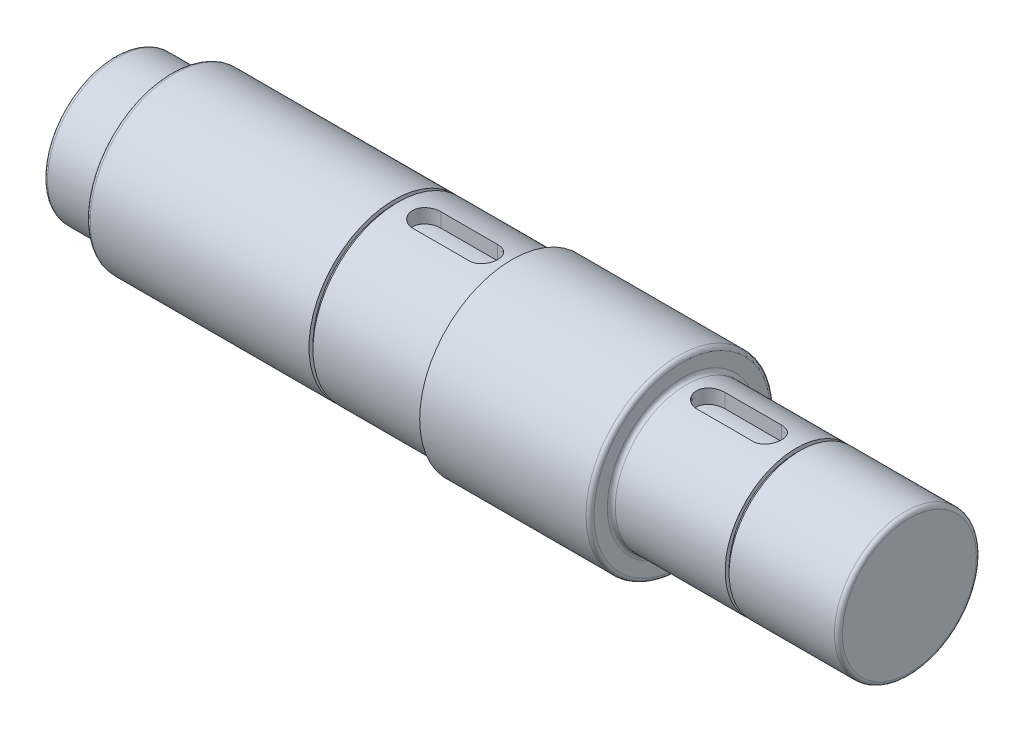
ISO-10303-21;
HEADER;
FILE_DESCRIPTION(('STEP AP214'),'2;1');
FILE_NAME('part.step','',(''),(''),'','','');
FILE_SCHEMA(('AUTOMOTIVE_DESIGN { 1 0 10303 214 1 1 1 1 }'));
ENDSEC;
DATA;
#1=APPLICATION_CONTEXT('core data for automotive mechanical design processes');
#2=APPLICATION_PROTOCOL_DEFINITION('international standard','automotive_design',2000,#1);
#3=PRODUCT_CONTEXT('',#1,'mechanical');
#4=PRODUCT('Part','Part','',(#3));
#5=PRODUCT_RELATED_PRODUCT_CATEGORY('part','',(#4));
#6=PRODUCT_DEFINITION_FORMATION('','',#4);
#7=PRODUCT_DEFINITION_CONTEXT('part definition',#1,'design');
#8=PRODUCT_DEFINITION('design','',#6,#7);
#9=PRODUCT_DEFINITION_SHAPE('','',#8);
#10=(LENGTH_UNIT() NAMED_UNIT(*) SI_UNIT(.MILLI.,.METRE.));
#11=(NAMED_UNIT(*) PLANE_ANGLE_UNIT() SI_UNIT($,.RADIAN.));
#12=(NAMED_UNIT(*) SI_UNIT($,.STERADIAN.) SOLID_ANGLE_UNIT());
#13=UNCERTAINTY_MEASURE_WITH_UNIT(LENGTH_MEASURE(1.E-05),#10,'distance_accuracy_value','');
#14=(GEOMETRIC_REPRESENTATION_CONTEXT(3) GLOBAL_UNCERTAINTY_ASSIGNED_CONTEXT((#13)) GLOBAL_UNIT_ASSIGNED_CONTEXT((#10,
#11,#12)) REPRESENTATION_CONTEXT('',''));
#15=CARTESIAN_POINT('',(0.,0.,0.));
#16=DIRECTION('',(0.,0.,1.));
#17=DIRECTION('',(1.,0.,0.));
#18=AXIS2_PLACEMENT_3D('',#15,#16,#17);
#19=CARTESIAN_POINT('',(330.2,0.,0.));
#20=DIRECTION('',(1.,0.,0.));
#21=DIRECTION('',(0.,0.,-1.));
#22=AXIS2_PLACEMENT_3D('',#19,#20,#21);
#23=CYLINDRICAL_SURFACE('',#22,31.75);
#24=CARTESIAN_POINT('',(255.778,0.,0.));
#25=DIRECTION('',(1.,0.,0.));
#26=DIRECTION('',(0.,0.,-1.));
#27=AXIS2_PLACEMENT_3D('',#24,#25,#26);
#28=CIRCLE('',#27,31.75);
#29=CARTESIAN_POINT('',(255.778,0.,-31.75));
#30=VERTEX_POINT('',#29);
#31=EDGE_CURVE('E261',#30,#30,#28,.T.);
#32=ORIENTED_EDGE('',*,*,#31,.T.);
#33=EDGE_LOOP('',(#32));
#34=FACE_BOUND('',#33,.T.);
#35=CARTESIAN_POINT('',(304.927,0.,0.));
#36=DIRECTION('',(1.,0.,0.));
#37=DIRECTION('',(0.,0.,-1.));
#38=AXIS2_PLACEMENT_3D('',#35,#36,#37);
#39=CIRCLE('',#38,31.75);
#40=CARTESIAN_POINT('',(304.927,0.,-31.75));
#41=VERTEX_POINT('',#40);
#42=EDGE_CURVE('E270',#41,#41,#39,.T.);
#43=ORIENTED_EDGE('',*,*,#42,.F.);
#44=EDGE_LOOP('',(#43));
#45=FACE_BOUND('',#44,.T.);
#46=CARTESIAN_POINT('',(292.1,31.1085197333463,6.35000000000002));
#47=CARTESIAN_POINT('',(292.941183858489,31.1085197333463,6.35000000000002));
#48=CARTESIAN_POINT('',(293.766428579741,31.143702637818,6.18365868766048));
#49=CARTESIAN_POINT('',(295.303132376778,31.2636096253235,5.54567957546157));
#50=CARTESIAN_POINT('',(296.006121908443,31.3474662779308,5.07414415278685));
#51=CARTESIAN_POINT('',(297.758254996811,31.597773091446,3.32198124296135));
#52=CARTESIAN_POINT('',(298.448650022899,31.749730004665,1.66607568080148));
#53=CARTESIAN_POINT('',(298.451345795129,31.7502691589406,-1.65576927079387));
#54=CARTESIAN_POINT('',(297.77212094636,31.599838788718,-3.30690169859766));
#55=CARTESIAN_POINT('',(295.412821853986,31.2626237555181,-5.66866529599972));
#56=CARTESIAN_POINT('',(293.782378674894,31.1085197333463,-6.35000000000002));
#57=CARTESIAN_POINT('',(292.1,31.1085197333463,-6.35000000000002));
#58=B_SPLINE_CURVE_WITH_KNOTS('',3,(#46,#47,#48,#49,#50,#51,#52,#53,#54,#55,#56,#57),
.UNSPECIFIED.,.F.,.F.,(4,2,2,2,2,4),(0.,0.125,0.25,0.5,0.75,1.),.UNSPECIFIED.);
#59=CARTESIAN_POINT('',(292.1,31.1085197333463,6.35000000000002));
#60=VERTEX_POINT('',#59);
#61=CARTESIAN_POINT('',(292.1,31.1085197333463,-6.35000000000002));
#62=VERTEX_POINT('',#61);
#63=EDGE_CURVE('E64',#60,#62,#58,.T.);
#64=ORIENTED_EDGE('',*,*,#63,.F.);
#65=DIRECTION('',(1.,0.,0.));
#66=VECTOR('',#65,1.);
#67=CARTESIAN_POINT('',(330.2,31.1085197333463,6.35000000000002));
#68=LINE('',#67,#66);
#69=CARTESIAN_POINT('',(266.7,31.1085197333463,6.35000000000002));
#70=VERTEX_POINT('',#69);
#71=EDGE_CURVE('E142',#70,#60,#68,.T.);
#72=ORIENTED_EDGE('',*,*,#71,.F.);
#73=CARTESIAN_POINT('',(266.7,31.1085197333463,-6.35000000000002));
#74=CARTESIAN_POINT('',(265.858816141511,31.1085197333463,-6.35000000000002));
#75=CARTESIAN_POINT('',(265.033571420259,31.143702637818,-6.18365868766048));
#76=CARTESIAN_POINT('',(263.496867623222,31.2636096253235,-5.54567957546157));
#77=CARTESIAN_POINT('',(262.793878091557,31.3474662779308,-5.07414415278685));
#78=CARTESIAN_POINT('',(261.041745003189,31.597773091446,-3.32198124296135));
#79=CARTESIAN_POINT('',(260.351349977102,31.749730004665,-1.66607568080148));
#80=CARTESIAN_POINT('',(260.348654204871,31.7502691589406,1.65576927079387));
#81=CARTESIAN_POINT('',(261.02787905364,31.599838788718,3.30690169859766));
#82=CARTESIAN_POINT('',(263.387178146013,31.2626237555181,5.66866529599972));
#83=CARTESIAN_POINT('',(265.017621325106,31.1085197333463,6.35000000000002));
#84=CARTESIAN_POINT('',(266.7,31.1085197333463,6.35000000000002));
#85=B_SPLINE_CURVE_WITH_KNOTS('',3,(#73,#74,#75,#76,#77,#78,#79,#80,#81,#82,#83,#84),
.UNSPECIFIED.,.F.,.F.,(4,2,2,2,2,4),(0.,0.125,0.25,0.5,0.75,1.),.UNSPECIFIED.);
#86=CARTESIAN_POINT('',(266.7,31.1085197333463,-6.35000000000002));
#87=VERTEX_POINT('',#86);
#88=EDGE_CURVE('E124',#87,#70,#85,.T.);
#89=ORIENTED_EDGE('',*,*,#88,.F.);
#90=DIRECTION('',(1.,0.,0.));
#91=VECTOR('',#90,1.);
#92=CARTESIAN_POINT('',(330.2,31.1085197333463,-6.35000000000002));
#93=LINE('',#92,#91);
#94=EDGE_CURVE('E133',#87,#62,#93,.T.);
#95=ORIENTED_EDGE('',*,*,#94,.T.);
#96=EDGE_LOOP('',(#64,#72,#89,#95));
#97=FACE_BOUND('',#96,.T.);
#98=ADVANCED_FACE('F45',(#34,#45,#97),#23,.T.);
#99=CARTESIAN_POINT('',(330.2,0.,0.));
#100=DIRECTION('',(1.,0.,0.));
#101=DIRECTION('',(0.,0.,-1.));
#102=AXIS2_PLACEMENT_3D('',#99,#100,#101);
#103=CYLINDRICAL_SURFACE('',#102,38.1);
#104=CARTESIAN_POINT('',(126.873,0.,0.));
#105=DIRECTION('',(1.,0.,0.));
#106=DIRECTION('',(0.,0.,-1.));
#107=AXIS2_PLACEMENT_3D('',#104,#105,#106);
#108=CIRCLE('',#107,38.1);
#109=CARTESIAN_POINT('',(126.873,0.,-38.1));
#110=VERTEX_POINT('',#109);
#111=EDGE_CURVE('E292',#110,#110,#108,.T.);
#112=ORIENTED_EDGE('',*,*,#111,.T.);
#113=EDGE_LOOP('',(#112));
#114=FACE_BOUND('',#113,.T.);
#115=CARTESIAN_POINT('',(177.8,0.,0.));
#116=DIRECTION('',(1.,0.,0.));
#117=DIRECTION('',(0.,0.,-1.));
#118=AXIS2_PLACEMENT_3D('',#115,#116,#117);
#119=CIRCLE('',#118,38.1);
#120=CARTESIAN_POINT('',(177.8,0.,-38.1));
#121=VERTEX_POINT('',#120);
#122=EDGE_CURVE('E289',#121,#121,#119,.T.);
#123=ORIENTED_EDGE('',*,*,#122,.F.);
#124=EDGE_LOOP('',(#123));
#125=FACE_BOUND('',#124,.T.);
#126=CARTESIAN_POINT('',(165.1,37.5671066226825,6.35000000000001));
#127=CARTESIAN_POINT('',(165.9404912156,37.5671066226825,6.35000000000001));
#128=CARTESIAN_POINT('',(166.765119907732,37.5961692347142,6.1840295214046));
#129=CARTESIAN_POINT('',(168.30219711681,37.6955353217467,5.54624008259869));
#130=CARTESIAN_POINT('',(169.005630987988,37.7651234129585,5.07464368548446));
#131=CARTESIAN_POINT('',(170.759335967874,37.9732531596112,3.32088304499708));
#132=CARTESIAN_POINT('',(171.448721103243,38.0997868506017,1.66436480079445));
#133=CARTESIAN_POINT('',(171.451275136449,38.1002125226802,-1.65459178591281));
#134=CARTESIAN_POINT('',(170.774511526088,37.9751325419471,-3.30436660193666));
#135=CARTESIAN_POINT('',(168.410969922329,37.6944708458059,-5.67066114956058));
#136=CARTESIAN_POINT('',(166.780983540741,37.5671066226825,-6.34999999999999));
#137=CARTESIAN_POINT('',(165.1,37.5671066226825,-6.34999999999999));
#138=B_SPLINE_CURVE_WITH_KNOTS('',3,(#126,#127,#128,#129,#130,#131,#132,#133,#134,#135,#136,
#137),.UNSPECIFIED.,.F.,.F.,(4,2,2,2,2,4),(0.,0.125,0.25,0.5,0.75,1.),.UNSPECIFIED.);
#139=CARTESIAN_POINT('',(165.1,37.5671066226825,6.34999999999998));
#140=VERTEX_POINT('',#139);
#141=CARTESIAN_POINT('',(165.1,37.5671066226825,-6.35000000000006));
#142=VERTEX_POINT('',#141);
#143=EDGE_CURVE('E73',#140,#142,#138,.T.);
#144=ORIENTED_EDGE('',*,*,#143,.F.);
#145=DIRECTION('',(1.,0.,0.));
#146=VECTOR('',#145,1.);
#147=CARTESIAN_POINT('',(330.2,37.5671066226825,6.34999999999995));
#148=LINE('',#147,#146);
#149=CARTESIAN_POINT('',(139.7,37.5671066226825,6.35));
#150=VERTEX_POINT('',#149);
#151=EDGE_CURVE('E386',#150,#140,#148,.T.);
#152=ORIENTED_EDGE('',*,*,#151,.F.);
#153=CARTESIAN_POINT('',(139.7,37.5671066226825,-6.34999999999998));
#154=CARTESIAN_POINT('',(138.8595087844,37.5671066226825,-6.34999999999998));
#155=CARTESIAN_POINT('',(138.034880092268,37.5961692347142,-6.18402952140457));
#156=CARTESIAN_POINT('',(136.49780288319,37.6955353217467,-5.54624008259866));
#157=CARTESIAN_POINT('',(135.794369012012,37.7651234129585,-5.07464368548443));
#158=CARTESIAN_POINT('',(134.040664032126,37.9732531596112,-3.32088304499704));
#159=CARTESIAN_POINT('',(133.351278896757,38.0997868506017,-1.66436480079441));
#160=CARTESIAN_POINT('',(133.348724863551,38.1002125226802,1.65459178591284));
#161=CARTESIAN_POINT('',(134.025488473912,37.9751325419471,3.3043666019367));
#162=CARTESIAN_POINT('',(136.389030077671,37.6944708458059,5.67066114956061));
#163=CARTESIAN_POINT('',(138.019016459259,37.5671066226825,6.35000000000002));
#164=CARTESIAN_POINT('',(139.7,37.5671066226825,6.35000000000002));
#165=B_SPLINE_CURVE_WITH_KNOTS('',3,(#153,#154,#155,#156,#157,#158,#159,#160,#161,#162,#163,
#164),.UNSPECIFIED.,.F.,.F.,(4,2,2,2,2,4),(0.,0.125,0.25,0.5,0.75,1.),.UNSPECIFIED.);
#166=CARTESIAN_POINT('',(139.7,37.5671066226825,-6.35000000000002));
#167=VERTEX_POINT('',#166);
#168=EDGE_CURVE('E204',#167,#150,#165,.T.);
#169=ORIENTED_EDGE('',*,*,#168,.F.);
#170=DIRECTION('',(1.,0.,0.));
#171=VECTOR('',#170,1.);
#172=CARTESIAN_POINT('',(330.2,37.5671066226825,-6.35000000000006));
#173=LINE('',#172,#171);
#174=EDGE_CURVE('E322',#167,#142,#173,.T.);
#175=ORIENTED_EDGE('',*,*,#174,.T.);
#176=EDGE_LOOP('',(#144,#152,#169,#175));
#177=FACE_BOUND('',#176,.T.);
#178=ADVANCED_FACE('F160',(#114,#125,#177),#103,.T.);
#179=CARTESIAN_POINT('',(355.6,0.,0.));
#180=DIRECTION('',(1.,0.,0.));
#181=DIRECTION('',(0.,0.,-1.));
#182=AXIS2_PLACEMENT_3D('',#179,#180,#181);
#183=PLANE('',#182);
#184=CARTESIAN_POINT('',(355.6,0.,0.));
#185=DIRECTION('',(1.,0.,0.));
#186=DIRECTION('',(0.,0.,-1.));
#187=AXIS2_PLACEMENT_3D('',#184,#185,#186);
#188=CIRCLE('',#187,29.972);
#189=CARTESIAN_POINT('',(355.6,0.,-29.972));
#190=VERTEX_POINT('',#189);
#191=EDGE_CURVE('E11',#190,#190,#188,.T.);
#192=ORIENTED_EDGE('',*,*,#191,.T.);
#193=EDGE_LOOP('',(#192));
#194=FACE_BOUND('',#193,.T.);
#195=ADVANCED_FACE('F47',(#194),#183,.T.);
#196=CARTESIAN_POINT('',(353.822,0.,0.));
#197=DIRECTION('',(1.,0.,0.));
#198=DIRECTION('',(0.,0.,-1.));
#199=AXIS2_PLACEMENT_3D('',#196,#197,#198);
#200=TOROIDAL_SURFACE('',#199,29.972,1.778);
#201=CARTESIAN_POINT('',(353.822,0.,0.));
#202=DIRECTION('',(1.,0.,0.));
#203=DIRECTION('',(0.,0.,-1.));
#204=AXIS2_PLACEMENT_3D('',#201,#202,#203);
#205=CIRCLE('',#204,31.75);
#206=CARTESIAN_POINT('',(353.822,0.,-31.75));
#207=VERTEX_POINT('',#206);
#208=EDGE_CURVE('E56',#207,#207,#205,.T.);
#209=ORIENTED_EDGE('',*,*,#208,.T.);
#210=EDGE_LOOP('',(#209));
#211=FACE_BOUND('',#210,.T.);
#212=ORIENTED_EDGE('',*,*,#191,.F.);
#213=EDGE_LOOP('',(#212));
#214=FACE_BOUND('',#213,.T.);
#215=ADVANCED_FACE('F179',(#211,#214),#200,.T.);
#216=CARTESIAN_POINT('',(330.2,0.,0.));
#217=DIRECTION('',(1.,0.,0.));
#218=DIRECTION('',(0.,0.,-1.));
#219=AXIS2_PLACEMENT_3D('',#216,#217,#218);
#220=CYLINDRICAL_SURFACE('',#219,31.75);
#221=ORIENTED_EDGE('',*,*,#208,.F.);
#222=EDGE_LOOP('',(#221));
#223=FACE_BOUND('',#222,.T.);
#224=CARTESIAN_POINT('',(306.705,0.,0.));
#225=DIRECTION('',(1.,0.,0.));
#226=DIRECTION('',(0.,0.,-1.));
#227=AXIS2_PLACEMENT_3D('',#224,#225,#226);
#228=CIRCLE('',#227,31.75);
#229=CARTESIAN_POINT('',(306.705,0.,-31.75));
#230=VERTEX_POINT('',#229);
#231=EDGE_CURVE('E191',#230,#230,#228,.T.);
#232=ORIENTED_EDGE('',*,*,#231,.T.);
#233=EDGE_LOOP('',(#232));
#234=FACE_BOUND('',#233,.T.);
#235=ADVANCED_FACE('F176',(#223,#234),#220,.T.);
#236=CARTESIAN_POINT('',(306.705,0.,-9.575673587392E-12));
#237=DIRECTION('',(-1.,0.,0.));
#238=DIRECTION('',(0.,0.,1.));
#239=AXIS2_PLACEMENT_3D('',#236,#237,#238);
#240=PLANE('',#239);
#241=CARTESIAN_POINT('',(306.705,0.,0.));
#242=DIRECTION('',(1.,0.,0.));
#243=DIRECTION('',(0.,0.,-1.));
#244=AXIS2_PLACEMENT_3D('',#241,#242,#243);
#245=CIRCLE('',#244,29.972);
#246=CARTESIAN_POINT('',(306.705,0.,-29.972));
#247=VERTEX_POINT('',#246);
#248=EDGE_CURVE('E194',#247,#247,#245,.T.);
#249=ORIENTED_EDGE('',*,*,#248,.T.);
#250=EDGE_LOOP('',(#249));
#251=FACE_BOUND('',#250,.T.);
#252=ORIENTED_EDGE('',*,*,#231,.F.);
#253=EDGE_LOOP('',(#252));
#254=FACE_BOUND('',#253,.T.);
#255=ADVANCED_FACE('F172',(#251,#254),#240,.T.);
#256=CARTESIAN_POINT('',(330.2,0.,0.));
#257=DIRECTION('',(1.,0.,0.));
#258=DIRECTION('',(0.,0.,-1.));
#259=AXIS2_PLACEMENT_3D('',#256,#257,#258);
#260=CYLINDRICAL_SURFACE('',#259,29.972);
#261=ORIENTED_EDGE('',*,*,#248,.F.);
#262=EDGE_LOOP('',(#261));
#263=FACE_BOUND('',#262,.T.);
#264=CARTESIAN_POINT('',(304.927,0.,0.));
#265=DIRECTION('',(1.,0.,0.));
#266=DIRECTION('',(0.,0.,-1.));
#267=AXIS2_PLACEMENT_3D('',#264,#265,#266);
#268=CIRCLE('',#267,29.972);
#269=CARTESIAN_POINT('',(304.927,0.,-29.972));
#270=VERTEX_POINT('',#269);
#271=EDGE_CURVE('E273',#270,#270,#268,.T.);
#272=ORIENTED_EDGE('',*,*,#271,.T.);
#273=EDGE_LOOP('',(#272));
#274=FACE_BOUND('',#273,.T.);
#275=ADVANCED_FACE('F168',(#263,#274),#260,.T.);
#276=CARTESIAN_POINT('',(304.927,0.,-9.5201624361607E-12));
#277=DIRECTION('',(-1.,0.,0.));
#278=DIRECTION('',(0.,0.,1.));
#279=AXIS2_PLACEMENT_3D('',#276,#277,#278);
#280=PLANE('',#279);
#281=ORIENTED_EDGE('',*,*,#271,.F.);
#282=EDGE_LOOP('',(#281));
#283=FACE_BOUND('',#282,.T.);
#284=ORIENTED_EDGE('',*,*,#42,.T.);
#285=EDGE_LOOP('',(#284));
#286=FACE_BOUND('',#285,.T.);
#287=ADVANCED_FACE('F164',(#283,#286),#280,.F.);
#288=CARTESIAN_POINT('',(255.778,0.,0.));
#289=DIRECTION('',(1.,0.,0.));
#290=DIRECTION('',(0.,0.,-1.));
#291=AXIS2_PLACEMENT_3D('',#288,#289,#290);
#292=TOROIDAL_SURFACE('',#291,33.528,1.778);
#293=CARTESIAN_POINT('',(254.,0.,0.));
#294=DIRECTION('',(1.,0.,0.));
#295=DIRECTION('',(0.,0.,-1.));
#296=AXIS2_PLACEMENT_3D('',#293,#294,#295);
#297=CIRCLE('',#296,33.528);
#298=CARTESIAN_POINT('',(254.,0.,-33.528));
#299=VERTEX_POINT('',#298);
#300=EDGE_CURVE('E254',#299,#299,#297,.T.);
#301=ORIENTED_EDGE('',*,*,#300,.T.);
#302=EDGE_LOOP('',(#301));
#303=FACE_BOUND('',#302,.T.);
#304=ORIENTED_EDGE('',*,*,#31,.F.);
#305=EDGE_LOOP('',(#304));
#306=FACE_BOUND('',#305,.T.);
#307=ADVANCED_FACE('F162',(#303,#306),#292,.F.);
#308=CARTESIAN_POINT('',(254.,0.,0.));
#309=DIRECTION('',(-1.,0.,0.));
#310=DIRECTION('',(0.,0.,1.));
#311=AXIS2_PLACEMENT_3D('',#308,#309,#310);
#312=PLANE('',#311);
#313=ORIENTED_EDGE('',*,*,#300,.F.);
#314=EDGE_LOOP('',(#313));
#315=FACE_BOUND('',#314,.T.);
#316=CARTESIAN_POINT('',(254.,0.,0.));
#317=DIRECTION('',(1.,0.,0.));
#318=DIRECTION('',(0.,0.,-1.));
#319=AXIS2_PLACEMENT_3D('',#316,#317,#318);
#320=CIRCLE('',#319,39.497);
#321=CARTESIAN_POINT('',(254.,0.,-39.497));
#322=VERTEX_POINT('',#321);
#323=EDGE_CURVE('E257',#322,#322,#320,.T.);
#324=ORIENTED_EDGE('',*,*,#323,.T.);
#325=EDGE_LOOP('',(#324));
#326=FACE_BOUND('',#325,.T.);
#327=ADVANCED_FACE('F243',(#315,#326),#312,.F.);
#328=CARTESIAN_POINT('',(252.222,0.,0.));
#329=DIRECTION('',(1.,0.,0.));
#330=DIRECTION('',(0.,0.,-1.));
#331=AXIS2_PLACEMENT_3D('',#328,#329,#330);
#332=TOROIDAL_SURFACE('',#331,39.497,1.778);
#333=CARTESIAN_POINT('',(252.222,0.,0.));
#334=DIRECTION('',(1.,0.,0.));
#335=DIRECTION('',(0.,0.,-1.));
#336=AXIS2_PLACEMENT_3D('',#333,#334,#335);
#337=CIRCLE('',#336,41.275);
#338=CARTESIAN_POINT('',(252.222,0.,-41.275));
#339=VERTEX_POINT('',#338);
#340=EDGE_CURVE('E259',#339,#339,#337,.T.);
#341=ORIENTED_EDGE('',*,*,#340,.T.);
#342=EDGE_LOOP('',(#341));
#343=FACE_BOUND('',#342,.T.);
#344=ORIENTED_EDGE('',*,*,#323,.F.);
#345=EDGE_LOOP('',(#344));
#346=FACE_BOUND('',#345,.T.);
#347=ADVANCED_FACE('F240',(#343,#346),#332,.T.);
#348=CARTESIAN_POINT('',(330.2,0.,0.));
#349=DIRECTION('',(1.,0.,0.));
#350=DIRECTION('',(0.,0.,-1.));
#351=AXIS2_PLACEMENT_3D('',#348,#349,#350);
#352=CYLINDRICAL_SURFACE('',#351,41.275);
#353=ORIENTED_EDGE('',*,*,#340,.F.);
#354=EDGE_LOOP('',(#353));
#355=FACE_BOUND('',#354,.T.);
#356=CARTESIAN_POINT('',(177.8,0.,0.));
#357=DIRECTION('',(1.,0.,0.));
#358=DIRECTION('',(0.,0.,-1.));
#359=AXIS2_PLACEMENT_3D('',#356,#357,#358);
#360=CIRCLE('',#359,41.275);
#361=CARTESIAN_POINT('',(177.8,0.,-41.275));
#362=VERTEX_POINT('',#361);
#363=EDGE_CURVE('E264',#362,#362,#360,.T.);
#364=ORIENTED_EDGE('',*,*,#363,.T.);
#365=EDGE_LOOP('',(#364));
#366=FACE_BOUND('',#365,.T.);
#367=ADVANCED_FACE('F236',(#355,#366),#352,.T.);
#368=CARTESIAN_POINT('',(177.8,0.,0.));
#369=DIRECTION('',(1.,0.,0.));
#370=DIRECTION('',(0.,0.,-1.));
#371=AXIS2_PLACEMENT_3D('',#368,#369,#370);
#372=PLANE('',#371);
#373=ORIENTED_EDGE('',*,*,#363,.F.);
#374=EDGE_LOOP('',(#373));
#375=FACE_BOUND('',#374,.T.);
#376=ORIENTED_EDGE('',*,*,#122,.T.);
#377=EDGE_LOOP('',(#376));
#378=FACE_BOUND('',#377,.T.);
#379=ADVANCED_FACE('F232',(#375,#378),#372,.F.);
#380=CARTESIAN_POINT('',(126.873,0.,0.));
#381=DIRECTION('',(-1.,0.,0.));
#382=DIRECTION('',(0.,0.,1.));
#383=AXIS2_PLACEMENT_3D('',#380,#381,#382);
#384=PLANE('',#383);
#385=CARTESIAN_POINT('',(126.873,0.,0.));
#386=DIRECTION('',(1.,0.,0.));
#387=DIRECTION('',(0.,0.,-1.));
#388=AXIS2_PLACEMENT_3D('',#385,#386,#387);
#389=CIRCLE('',#388,36.322);
#390=CARTESIAN_POINT('',(126.873,0.,-36.322));
#391=VERTEX_POINT('',#390);
#392=EDGE_CURVE('E295',#391,#391,#389,.T.);
#393=ORIENTED_EDGE('',*,*,#392,.T.);
#394=EDGE_LOOP('',(#393));
#395=FACE_BOUND('',#394,.T.);
#396=ORIENTED_EDGE('',*,*,#111,.F.);
#397=EDGE_LOOP('',(#396));
#398=FACE_BOUND('',#397,.T.);
#399=ADVANCED_FACE('F228',(#395,#398),#384,.T.);
#400=CARTESIAN_POINT('',(330.2,0.,0.));
#401=DIRECTION('',(1.,0.,0.));
#402=DIRECTION('',(0.,0.,-1.));
#403=AXIS2_PLACEMENT_3D('',#400,#401,#402);
#404=CYLINDRICAL_SURFACE('',#403,36.322);
#405=CARTESIAN_POINT('',(125.095,0.,0.));
#406=DIRECTION('',(1.,0.,0.));
#407=DIRECTION('',(0.,0.,-1.));
#408=AXIS2_PLACEMENT_3D('',#405,#406,#407);
#409=CIRCLE('',#408,36.322);
#410=CARTESIAN_POINT('',(125.095,0.,-36.322));
#411=VERTEX_POINT('',#410);
#412=EDGE_CURVE('E298',#411,#411,#409,.T.);
#413=ORIENTED_EDGE('',*,*,#412,.T.);
#414=EDGE_LOOP('',(#413));
#415=FACE_BOUND('',#414,.T.);
#416=ORIENTED_EDGE('',*,*,#392,.F.);
#417=EDGE_LOOP('',(#416));
#418=FACE_BOUND('',#417,.T.);
#419=ADVANCED_FACE('F224',(#415,#418),#404,.T.);
#420=CARTESIAN_POINT('',(125.095,0.,-1.95280299867104E-12));
#421=DIRECTION('',(-1.,0.,0.));
#422=DIRECTION('',(0.,0.,1.));
#423=AXIS2_PLACEMENT_3D('',#420,#421,#422);
#424=PLANE('',#423);
#425=ORIENTED_EDGE('',*,*,#412,.F.);
#426=EDGE_LOOP('',(#425));
#427=FACE_BOUND('',#426,.T.);
#428=CARTESIAN_POINT('',(125.095,0.,0.));
#429=DIRECTION('',(1.,0.,0.));
#430=DIRECTION('',(0.,0.,-1.));
#431=AXIS2_PLACEMENT_3D('',#428,#429,#430);
#432=CIRCLE('',#431,38.1);
#433=CARTESIAN_POINT('',(125.095,0.,-38.1));
#434=VERTEX_POINT('',#433);
#435=EDGE_CURVE('E301',#434,#434,#432,.T.);
#436=ORIENTED_EDGE('',*,*,#435,.T.);
#437=EDGE_LOOP('',(#436));
#438=FACE_BOUND('',#437,.T.);
#439=ADVANCED_FACE('F218',(#427,#438),#424,.F.);
#440=ORIENTED_EDGE('',*,*,#435,.F.);
#441=EDGE_LOOP('',(#440));
#442=FACE_BOUND('',#441,.T.);
#443=CARTESIAN_POINT('',(27.178,0.,0.));
#444=DIRECTION('',(1.,0.,0.));
#445=DIRECTION('',(0.,0.,-1.));
#446=AXIS2_PLACEMENT_3D('',#443,#444,#445);
#447=CIRCLE('',#446,38.1);
#448=CARTESIAN_POINT('',(27.178,0.,-38.1));
#449=VERTEX_POINT('',#448);
#450=EDGE_CURVE('E304',#449,#449,#447,.T.);
#451=ORIENTED_EDGE('',*,*,#450,.T.);
#452=EDGE_LOOP('',(#451));
#453=FACE_BOUND('',#452,.T.);
#454=ADVANCED_FACE('F207',(#442,#453),#103,.T.);
#455=CARTESIAN_POINT('',(27.178,0.,0.));
#456=DIRECTION('',(1.,0.,0.));
#457=DIRECTION('',(0.,0.,-1.));
#458=AXIS2_PLACEMENT_3D('',#455,#456,#457);
#459=TOROIDAL_SURFACE('',#458,36.322,1.778);
#460=CARTESIAN_POINT('',(25.4,0.,0.));
#461=DIRECTION('',(1.,0.,0.));
#462=DIRECTION('',(0.,0.,-1.));
#463=AXIS2_PLACEMENT_3D('',#460,#461,#462);
#464=CIRCLE('',#463,36.322);
#465=CARTESIAN_POINT('',(25.4,0.,-36.322));
#466=VERTEX_POINT('',#465);
#467=EDGE_CURVE('E307',#466,#466,#464,.T.);
#468=ORIENTED_EDGE('',*,*,#467,.T.);
#469=EDGE_LOOP('',(#468));
#470=FACE_BOUND('',#469,.T.);
#471=ORIENTED_EDGE('',*,*,#450,.F.);
#472=EDGE_LOOP('',(#471));
#473=FACE_BOUND('',#472,.T.);
#474=ADVANCED_FACE('F217',(#470,#473),#459,.T.);
#475=CARTESIAN_POINT('',(25.4,0.,0.));
#476=DIRECTION('',(1.,0.,0.));
#477=DIRECTION('',(0.,0.,-1.));
#478=AXIS2_PLACEMENT_3D('',#475,#476,#477);
#479=PLANE('',#478);
#480=ORIENTED_EDGE('',*,*,#467,.F.);
#481=EDGE_LOOP('',(#480));
#482=FACE_BOUND('',#481,.T.);
#483=CARTESIAN_POINT('',(25.4,0.,0.));
#484=DIRECTION('',(1.,0.,0.));
#485=DIRECTION('',(0.,0.,-1.));
#486=AXIS2_PLACEMENT_3D('',#483,#484,#485);
#487=CIRCLE('',#486,33.528);
#488=CARTESIAN_POINT('',(25.4,0.,-33.528));
#489=VERTEX_POINT('',#488);
#490=EDGE_CURVE('E310',#489,#489,#487,.T.);
#491=ORIENTED_EDGE('',*,*,#490,.T.);
#492=EDGE_LOOP('',(#491));
#493=FACE_BOUND('',#492,.T.);
#494=ADVANCED_FACE('F648',(#482,#493),#479,.F.);
#495=CARTESIAN_POINT('',(23.622,0.,0.));
#496=DIRECTION('',(1.,0.,0.));
#497=DIRECTION('',(0.,0.,-1.));
#498=AXIS2_PLACEMENT_3D('',#495,#496,#497);
#499=TOROIDAL_SURFACE('',#498,33.528,1.778);
#500=CARTESIAN_POINT('',(23.622,0.,0.));
#501=DIRECTION('',(1.,0.,0.));
#502=DIRECTION('',(0.,0.,-1.));
#503=AXIS2_PLACEMENT_3D('',#500,#501,#502);
#504=CIRCLE('',#503,31.75);
#505=CARTESIAN_POINT('',(23.622,0.,-31.75));
#506=VERTEX_POINT('',#505);
#507=EDGE_CURVE('E313',#506,#506,#504,.T.);
#508=ORIENTED_EDGE('',*,*,#507,.T.);
#509=EDGE_LOOP('',(#508));
#510=FACE_BOUND('',#509,.T.);
#511=ORIENTED_EDGE('',*,*,#490,.F.);
#512=EDGE_LOOP('',(#511));
#513=FACE_BOUND('',#512,.T.);
#514=ADVANCED_FACE('F639',(#510,#513),#499,.F.);
#515=CARTESIAN_POINT('',(330.2,0.,0.));
#516=DIRECTION('',(1.,0.,0.));
#517=DIRECTION('',(0.,0.,-1.));
#518=AXIS2_PLACEMENT_3D('',#515,#516,#517);
#519=CYLINDRICAL_SURFACE('',#518,31.75);
#520=ORIENTED_EDGE('',*,*,#507,.F.);
#521=EDGE_LOOP('',(#520));
#522=FACE_BOUND('',#521,.T.);
#523=CARTESIAN_POINT('',(1.778,0.,0.));
#524=DIRECTION('',(1.,0.,0.));
#525=DIRECTION('',(0.,0.,-1.));
#526=AXIS2_PLACEMENT_3D('',#523,#524,#525);
#527=CIRCLE('',#526,31.75);
#528=CARTESIAN_POINT('',(1.778,0.,-31.75));
#529=VERTEX_POINT('',#528);
#530=EDGE_CURVE('E316',#529,#529,#527,.T.);
#531=ORIENTED_EDGE('',*,*,#530,.T.);
#532=EDGE_LOOP('',(#531));
#533=FACE_BOUND('',#532,.T.);
#534=ADVANCED_FACE('F631',(#522,#533),#519,.T.);
#535=CARTESIAN_POINT('',(1.778,0.,0.));
#536=DIRECTION('',(1.,0.,0.));
#537=DIRECTION('',(0.,0.,-1.));
#538=AXIS2_PLACEMENT_3D('',#535,#536,#537);
#539=TOROIDAL_SURFACE('',#538,29.972,1.778);
#540=CARTESIAN_POINT('',(0.,0.,0.));
#541=DIRECTION('',(1.,0.,0.));
#542=DIRECTION('',(0.,0.,-1.));
#543=AXIS2_PLACEMENT_3D('',#540,#541,#542);
#544=CIRCLE('',#543,29.972);
#545=CARTESIAN_POINT('',(0.,0.,-29.972));
#546=VERTEX_POINT('',#545);
#547=EDGE_CURVE('E319',#546,#546,#544,.T.);
#548=ORIENTED_EDGE('',*,*,#547,.T.);
#549=EDGE_LOOP('',(#548));
#550=FACE_BOUND('',#549,.T.);
#551=ORIENTED_EDGE('',*,*,#530,.F.);
#552=EDGE_LOOP('',(#551));
#553=FACE_BOUND('',#552,.T.);
#554=ADVANCED_FACE('F623',(#550,#553),#539,.T.);
#555=CARTESIAN_POINT('',(0.,0.,0.));
#556=DIRECTION('',(1.,0.,0.));
#557=DIRECTION('',(0.,0.,-1.));
#558=AXIS2_PLACEMENT_3D('',#555,#556,#557);
#559=PLANE('',#558);
#560=ORIENTED_EDGE('',*,*,#547,.F.);
#561=EDGE_LOOP('',(#560));
#562=FACE_BOUND('',#561,.T.);
#563=ADVANCED_FACE('F349',(#562),#559,.F.);
#564=CARTESIAN_POINT('',(330.2,-6.35,0.));
#565=DIRECTION('',(1.,0.,0.));
#566=DIRECTION('',(0.,0.,-1.));
#567=AXIS2_PLACEMENT_3D('',#564,#565,#566);
#568=CYLINDRICAL_SURFACE('',#567,38.1);
#569=DIRECTION('',(1.,0.,0.));
#570=VECTOR('',#569,1.);
#571=CARTESIAN_POINT('',(330.2,31.2171066226825,-6.35000000000006));
#572=LINE('',#571,#570);
#573=CARTESIAN_POINT('',(139.7,31.2171066226825,-6.35000000000002));
#574=VERTEX_POINT('',#573);
#575=CARTESIAN_POINT('',(165.1,31.2171066226825,-6.35000000000002));
#576=VERTEX_POINT('',#575);
#577=EDGE_CURVE('E392',#574,#576,#572,.T.);
#578=ORIENTED_EDGE('',*,*,#577,.F.);
#579=CARTESIAN_POINT('',(139.7,31.2171066226825,6.35000000000002));
#580=CARTESIAN_POINT('',(138.019016459259,31.2171066226825,6.35000000000002));
#581=CARTESIAN_POINT('',(136.389030077671,31.3444708458059,5.67066114956061));
#582=CARTESIAN_POINT('',(134.025488473912,31.6251325419471,3.3043666019367));
#583=CARTESIAN_POINT('',(133.348724863551,31.7502125226802,1.65459178591284));
#584=CARTESIAN_POINT('',(133.351278896757,31.7497868506017,-1.66436480079441));
#585=CARTESIAN_POINT('',(134.040664032126,31.6232531596112,-3.32088304499704));
#586=CARTESIAN_POINT('',(135.794369012012,31.4151234129585,-5.07464368548443));
#587=CARTESIAN_POINT('',(136.49780288319,31.3455353217467,-5.54624008259866));
#588=CARTESIAN_POINT('',(138.034880092268,31.2461692347142,-6.18402952140457));
#589=CARTESIAN_POINT('',(138.8595087844,31.2171066226825,-6.34999999999998));
#590=CARTESIAN_POINT('',(139.7,31.2171066226825,-6.34999999999998));
#591=B_SPLINE_CURVE_WITH_KNOTS('',3,(#579,#580,#581,#582,#583,#584,#585,#586,#587,#588,#589,
#590),.UNSPECIFIED.,.F.,.F.,(4,2,2,2,2,4),(0.,0.25,0.5,0.75,0.875,1.),.UNSPECIFIED.);
#592=CARTESIAN_POINT('',(139.7,31.2171066226825,6.35));
#593=VERTEX_POINT('',#592);
#594=EDGE_CURVE('E370',#574,#593,#591,.F.);
#595=ORIENTED_EDGE('',*,*,#594,.T.);
#596=DIRECTION('',(1.,0.,0.));
#597=VECTOR('',#596,1.);
#598=CARTESIAN_POINT('',(330.2,31.2171066226825,6.34999999999995));
#599=LINE('',#598,#597);
#600=CARTESIAN_POINT('',(165.1,31.2171066226825,6.34999999999998));
#601=VERTEX_POINT('',#600);
#602=EDGE_CURVE('E361',#593,#601,#599,.T.);
#603=ORIENTED_EDGE('',*,*,#602,.T.);
#604=CARTESIAN_POINT('',(165.1,31.2171066226825,-6.34999999999999));
#605=CARTESIAN_POINT('',(166.780983540741,31.2171066226826,-6.34999999999999));
#606=CARTESIAN_POINT('',(168.410969922329,31.3444708458059,-5.67066114956058));
#607=CARTESIAN_POINT('',(170.774511526088,31.6251325419471,-3.30436660193666));
#608=CARTESIAN_POINT('',(171.451275136449,31.7502125226802,-1.65459178591281));
#609=CARTESIAN_POINT('',(171.448721103243,31.7497868506018,1.66436480079445));
#610=CARTESIAN_POINT('',(170.759335967874,31.6232531596112,3.32088304499708));
#611=CARTESIAN_POINT('',(169.005630987988,31.4151234129585,5.07464368548446));
#612=CARTESIAN_POINT('',(168.30219711681,31.3455353217467,5.54624008259869));
#613=CARTESIAN_POINT('',(166.765119907732,31.2461692347142,6.1840295214046));
#614=CARTESIAN_POINT('',(165.9404912156,31.2171066226825,6.35000000000001));
#615=CARTESIAN_POINT('',(165.1,31.2171066226825,6.35000000000001));
#616=B_SPLINE_CURVE_WITH_KNOTS('',3,(#604,#605,#606,#607,#608,#609,#610,#611,#612,#613,#614,
#615),.UNSPECIFIED.,.F.,.F.,(4,2,2,2,2,4),(0.,0.25,0.5,0.75,0.875,1.),.UNSPECIFIED.);
#617=EDGE_CURVE('E137',#601,#576,#616,.F.);
#618=ORIENTED_EDGE('',*,*,#617,.T.);
#619=EDGE_LOOP('',(#578,#595,#603,#618));
#620=FACE_BOUND('',#619,.T.);
#621=ADVANCED_FACE('F338',(#620),#568,.T.);
#622=CARTESIAN_POINT('',(165.1,37.5671066226825,6.35000000000001));
#623=CARTESIAN_POINT('',(165.9404912156,37.5671066226825,6.35000000000001));
#624=CARTESIAN_POINT('',(166.765119907732,37.5961692347142,6.1840295214046));
#625=CARTESIAN_POINT('',(168.30219711681,37.6955353217467,5.54624008259869));
#626=CARTESIAN_POINT('',(169.005630987988,37.7651234129585,5.07464368548446));
#627=CARTESIAN_POINT('',(170.759335967874,37.9732531596112,3.32088304499708));
#628=CARTESIAN_POINT('',(171.448721103243,38.0997868506017,1.66436480079445));
#629=CARTESIAN_POINT('',(171.451275136449,38.1002125226802,-1.65459178591281));
#630=CARTESIAN_POINT('',(170.774511526088,37.9751325419471,-3.30436660193666));
#631=CARTESIAN_POINT('',(168.410969922329,37.6944708458059,-5.67066114956058));
#632=CARTESIAN_POINT('',(166.780983540741,37.5671066226825,-6.34999999999999));
#633=CARTESIAN_POINT('',(165.1,37.5671066226825,-6.34999999999999));
#634=B_SPLINE_CURVE_WITH_KNOTS('',3,(#622,#623,#624,#625,#626,#627,#628,#629,#630,#631,#632,
#633),.UNSPECIFIED.,.F.,.F.,(4,2,2,2,2,4),(0.,0.125,0.25,0.5,0.75,1.),.UNSPECIFIED.);
#635=DIRECTION('',(0.,-1.,0.));
#636=VECTOR('',#635,1.);
#637=SURFACE_OF_LINEAR_EXTRUSION('',#634,#636);
#638=ORIENTED_EDGE('',*,*,#617,.F.);
#639=DIRECTION('',(0.,-1.,0.));
#640=VECTOR('',#639,1.);
#641=CARTESIAN_POINT('',(165.1,37.5671066226825,6.34999999999995));
#642=LINE('',#641,#640);
#643=EDGE_CURVE('E373',#140,#601,#642,.T.);
#644=ORIENTED_EDGE('',*,*,#643,.F.);
#645=ORIENTED_EDGE('',*,*,#143,.T.);
#646=DIRECTION('',(0.,-1.,0.));
#647=VECTOR('',#646,1.);
#648=CARTESIAN_POINT('',(165.1,37.5671066226825,-6.35000000000006));
#649=LINE('',#648,#647);
#650=EDGE_CURVE('E378',#142,#576,#649,.T.);
#651=ORIENTED_EDGE('',*,*,#650,.T.);
#652=EDGE_LOOP('',(#638,#644,#645,#651));
#653=FACE_BOUND('',#652,.T.);
#654=ADVANCED_FACE('F348',(#653),#637,.T.);
#655=CARTESIAN_POINT('',(330.2,37.5671066226825,6.34999999999995));
#656=DIRECTION('',(0.,0.,-1.));
#657=DIRECTION('',(-1.,0.,0.));
#658=AXIS2_PLACEMENT_3D('',#655,#656,#657);
#659=PLANE('',#658);
#660=ORIENTED_EDGE('',*,*,#602,.F.);
#661=DIRECTION('',(0.,-1.,0.));
#662=VECTOR('',#661,1.);
#663=CARTESIAN_POINT('',(139.7,37.5671066226825,6.35000000000002));
#664=LINE('',#663,#662);
#665=EDGE_CURVE('E381',#150,#593,#664,.T.);
#666=ORIENTED_EDGE('',*,*,#665,.F.);
#667=ORIENTED_EDGE('',*,*,#151,.T.);
#668=ORIENTED_EDGE('',*,*,#643,.T.);
#669=EDGE_LOOP('',(#660,#666,#667,#668));
#670=FACE_BOUND('',#669,.T.);
#671=ADVANCED_FACE('F387',(#670),#659,.T.);
#672=CARTESIAN_POINT('',(139.7,37.5671066226825,-6.34999999999998));
#673=CARTESIAN_POINT('',(138.8595087844,37.5671066226825,-6.34999999999998));
#674=CARTESIAN_POINT('',(138.034880092268,37.5961692347142,-6.18402952140457));
#675=CARTESIAN_POINT('',(136.49780288319,37.6955353217467,-5.54624008259866));
#676=CARTESIAN_POINT('',(135.794369012012,37.7651234129585,-5.07464368548443));
#677=CARTESIAN_POINT('',(134.040664032126,37.9732531596112,-3.32088304499704));
#678=CARTESIAN_POINT('',(133.351278896757,38.0997868506017,-1.66436480079441));
#679=CARTESIAN_POINT('',(133.348724863551,38.1002125226802,1.65459178591284));
#680=CARTESIAN_POINT('',(134.025488473912,37.9751325419471,3.3043666019367));
#681=CARTESIAN_POINT('',(136.389030077671,37.6944708458059,5.67066114956061));
#682=CARTESIAN_POINT('',(138.019016459259,37.5671066226825,6.35000000000002));
#683=CARTESIAN_POINT('',(139.7,37.5671066226825,6.35000000000002));
#684=B_SPLINE_CURVE_WITH_KNOTS('',3,(#672,#673,#674,#675,#676,#677,#678,#679,#680,#681,#682,
#683),.UNSPECIFIED.,.F.,.F.,(4,2,2,2,2,4),(0.,0.125,0.25,0.5,0.75,1.),.UNSPECIFIED.);
#685=DIRECTION('',(0.,-1.,0.));
#686=VECTOR('',#685,1.);
#687=SURFACE_OF_LINEAR_EXTRUSION('',#684,#686);
#688=ORIENTED_EDGE('',*,*,#594,.F.);
#689=DIRECTION('',(0.,-1.,0.));
#690=VECTOR('',#689,1.);
#691=CARTESIAN_POINT('',(139.7,37.5671066226825,-6.35000000000006));
#692=LINE('',#691,#690);
#693=EDGE_CURVE('E786',#167,#574,#692,.T.);
#694=ORIENTED_EDGE('',*,*,#693,.F.);
#695=ORIENTED_EDGE('',*,*,#168,.T.);
#696=ORIENTED_EDGE('',*,*,#665,.T.);
#697=EDGE_LOOP('',(#688,#694,#695,#696));
#698=FACE_BOUND('',#697,.T.);
#699=ADVANCED_FACE('F409',(#698),#687,.T.);
#700=CARTESIAN_POINT('',(330.2,37.5671066226825,-6.35000000000006));
#701=DIRECTION('',(0.,0.,-1.));
#702=DIRECTION('',(-1.,0.,0.));
#703=AXIS2_PLACEMENT_3D('',#700,#701,#702);
#704=PLANE('',#703);
#705=ORIENTED_EDGE('',*,*,#577,.T.);
#706=ORIENTED_EDGE('',*,*,#650,.F.);
#707=ORIENTED_EDGE('',*,*,#174,.F.);
#708=ORIENTED_EDGE('',*,*,#693,.T.);
#709=EDGE_LOOP('',(#705,#706,#707,#708));
#710=FACE_BOUND('',#709,.T.);
#711=ADVANCED_FACE('F350',(#710),#704,.F.);
#712=CARTESIAN_POINT('',(330.2,-6.35,0.));
#713=DIRECTION('',(1.,0.,0.));
#714=DIRECTION('',(0.,0.,-1.));
#715=AXIS2_PLACEMENT_3D('',#712,#713,#714);
#716=CYLINDRICAL_SURFACE('',#715,31.75);
#717=DIRECTION('',(1.,0.,0.));
#718=VECTOR('',#717,1.);
#719=CARTESIAN_POINT('',(330.2,24.7585197333463,-6.35000000000002));
#720=LINE('',#719,#718);
#721=CARTESIAN_POINT('',(266.7,24.7585197333463,-6.35000000000002));
#722=VERTEX_POINT('',#721);
#723=CARTESIAN_POINT('',(292.1,24.7585197333463,-6.35000000000002));
#724=VERTEX_POINT('',#723);
#725=EDGE_CURVE('E138',#722,#724,#720,.T.);
#726=ORIENTED_EDGE('',*,*,#725,.F.);
#727=CARTESIAN_POINT('',(266.7,24.7585197333464,6.35000000000002));
#728=CARTESIAN_POINT('',(265.017621325106,24.7585197333464,6.35000000000002));
#729=CARTESIAN_POINT('',(263.387178146013,24.9126237555181,5.66866529599972));
#730=CARTESIAN_POINT('',(261.02787905364,25.249838788718,3.30690169859766));
#731=CARTESIAN_POINT('',(260.348654204871,25.4002691589406,1.65576927079387));
#732=CARTESIAN_POINT('',(260.351349977102,25.399730004665,-1.66607568080148));
#733=CARTESIAN_POINT('',(261.041745003189,25.247773091446,-3.32198124296135));
#734=CARTESIAN_POINT('',(262.793878091557,24.9974662779309,-5.07414415278685));
#735=CARTESIAN_POINT('',(263.496867623222,24.9136096253235,-5.54567957546157));
#736=CARTESIAN_POINT('',(265.033571420259,24.793702637818,-6.18365868766048));
#737=CARTESIAN_POINT('',(265.858816141511,24.7585197333464,-6.35000000000002));
#738=CARTESIAN_POINT('',(266.7,24.7585197333464,-6.35000000000002));
#739=B_SPLINE_CURVE_WITH_KNOTS('',3,(#727,#728,#729,#730,#731,#732,#733,#734,#735,#736,#737,
#738),.UNSPECIFIED.,.F.,.F.,(4,2,2,2,2,4),(0.,0.25,0.5,0.75,0.875,1.),.UNSPECIFIED.);
#740=CARTESIAN_POINT('',(266.7,24.7585197333463,6.35000000000002));
#741=VERTEX_POINT('',#740);
#742=EDGE_CURVE('E127',#722,#741,#739,.F.);
#743=ORIENTED_EDGE('',*,*,#742,.T.);
#744=DIRECTION('',(1.,0.,0.));
#745=VECTOR('',#744,1.);
#746=CARTESIAN_POINT('',(330.2,24.7585197333463,6.35000000000002));
#747=LINE('',#746,#745);
#748=CARTESIAN_POINT('',(292.1,24.7585197333463,6.35000000000002));
#749=VERTEX_POINT('',#748);
#750=EDGE_CURVE('E460',#741,#749,#747,.T.);
#751=ORIENTED_EDGE('',*,*,#750,.T.);
#752=CARTESIAN_POINT('',(292.1,24.7585197333463,-6.35000000000002));
#753=CARTESIAN_POINT('',(293.782378674894,24.7585197333463,-6.35000000000002));
#754=CARTESIAN_POINT('',(295.412821853986,24.9126237555181,-5.66866529599972));
#755=CARTESIAN_POINT('',(297.77212094636,25.249838788718,-3.30690169859766));
#756=CARTESIAN_POINT('',(298.451345795129,25.4002691589406,-1.65576927079387));
#757=CARTESIAN_POINT('',(298.448650022899,25.399730004665,1.66607568080148));
#758=CARTESIAN_POINT('',(297.758254996811,25.247773091446,3.32198124296135));
#759=CARTESIAN_POINT('',(296.006121908443,24.9974662779309,5.07414415278685));
#760=CARTESIAN_POINT('',(295.303132376778,24.9136096253235,5.54567957546157));
#761=CARTESIAN_POINT('',(293.766428579741,24.793702637818,6.18365868766048));
#762=CARTESIAN_POINT('',(292.941183858489,24.7585197333463,6.35000000000002));
#763=CARTESIAN_POINT('',(292.1,24.7585197333463,6.35000000000002));
#764=B_SPLINE_CURVE_WITH_KNOTS('',3,(#752,#753,#754,#755,#756,#757,#758,#759,#760,#761,#762,
#763),.UNSPECIFIED.,.F.,.F.,(4,2,2,2,2,4),(0.,0.25,0.5,0.75,0.875,1.),.UNSPECIFIED.);
#765=EDGE_CURVE('E472',#749,#724,#764,.F.);
#766=ORIENTED_EDGE('',*,*,#765,.T.);
#767=EDGE_LOOP('',(#726,#743,#751,#766));
#768=FACE_BOUND('',#767,.T.);
#769=ADVANCED_FACE('F441',(#768),#716,.T.);
#770=CARTESIAN_POINT('',(292.1,31.1085197333463,6.35000000000002));
#771=CARTESIAN_POINT('',(292.941183858489,31.1085197333463,6.35000000000002));
#772=CARTESIAN_POINT('',(293.766428579741,31.143702637818,6.18365868766048));
#773=CARTESIAN_POINT('',(295.303132376778,31.2636096253235,5.54567957546157));
#774=CARTESIAN_POINT('',(296.006121908443,31.3474662779308,5.07414415278685));
#775=CARTESIAN_POINT('',(297.758254996811,31.597773091446,3.32198124296135));
#776=CARTESIAN_POINT('',(298.448650022899,31.749730004665,1.66607568080148));
#777=CARTESIAN_POINT('',(298.451345795129,31.7502691589406,-1.65576927079387));
#778=CARTESIAN_POINT('',(297.77212094636,31.599838788718,-3.30690169859766));
#779=CARTESIAN_POINT('',(295.412821853986,31.2626237555181,-5.66866529599972));
#780=CARTESIAN_POINT('',(293.782378674894,31.1085197333463,-6.35000000000002));
#781=CARTESIAN_POINT('',(292.1,31.1085197333463,-6.35000000000002));
#782=B_SPLINE_CURVE_WITH_KNOTS('',3,(#770,#771,#772,#773,#774,#775,#776,#777,#778,#779,#780,
#781),.UNSPECIFIED.,.F.,.F.,(4,2,2,2,2,4),(0.,0.125,0.25,0.5,0.75,1.),.UNSPECIFIED.);
#783=DIRECTION('',(0.,-1.,0.));
#784=VECTOR('',#783,1.);
#785=SURFACE_OF_LINEAR_EXTRUSION('',#782,#784);
#786=ORIENTED_EDGE('',*,*,#765,.F.);
#787=DIRECTION('',(0.,-1.,0.));
#788=VECTOR('',#787,1.);
#789=CARTESIAN_POINT('',(292.1,31.1085197333463,6.35000000000002));
#790=LINE('',#789,#788);
#791=EDGE_CURVE('E470',#60,#749,#790,.T.);
#792=ORIENTED_EDGE('',*,*,#791,.F.);
#793=ORIENTED_EDGE('',*,*,#63,.T.);
#794=DIRECTION('',(0.,-1.,0.));
#795=VECTOR('',#794,1.);
#796=CARTESIAN_POINT('',(292.1,31.1085197333463,-6.35000000000002));
#797=LINE('',#796,#795);
#798=EDGE_CURVE('E135',#62,#724,#797,.T.);
#799=ORIENTED_EDGE('',*,*,#798,.T.);
#800=EDGE_LOOP('',(#786,#792,#793,#799));
#801=FACE_BOUND('',#800,.T.);
#802=ADVANCED_FACE('F446',(#801),#785,.T.);
#803=CARTESIAN_POINT('',(330.2,31.1085197333463,6.35000000000002));
#804=DIRECTION('',(0.,0.,-1.));
#805=DIRECTION('',(-1.,0.,0.));
#806=AXIS2_PLACEMENT_3D('',#803,#804,#805);
#807=PLANE('',#806);
#808=ORIENTED_EDGE('',*,*,#750,.F.);
#809=DIRECTION('',(0.,-1.,0.));
#810=VECTOR('',#809,1.);
#811=CARTESIAN_POINT('',(266.7,31.1085197333463,6.35000000000002));
#812=LINE('',#811,#810);
#813=EDGE_CURVE('E534',#70,#741,#812,.T.);
#814=ORIENTED_EDGE('',*,*,#813,.F.);
#815=ORIENTED_EDGE('',*,*,#71,.T.);
#816=ORIENTED_EDGE('',*,*,#791,.T.);
#817=EDGE_LOOP('',(#808,#814,#815,#816));
#818=FACE_BOUND('',#817,.T.);
#819=ADVANCED_FACE('F492',(#818),#807,.T.);
#820=CARTESIAN_POINT('',(266.7,31.1085197333463,-6.35000000000002));
#821=CARTESIAN_POINT('',(265.858816141511,31.1085197333463,-6.35000000000002));
#822=CARTESIAN_POINT('',(265.033571420259,31.143702637818,-6.18365868766048));
#823=CARTESIAN_POINT('',(263.496867623222,31.2636096253235,-5.54567957546157));
#824=CARTESIAN_POINT('',(262.793878091557,31.3474662779308,-5.07414415278685));
#825=CARTESIAN_POINT('',(261.041745003189,31.597773091446,-3.32198124296135));
#826=CARTESIAN_POINT('',(260.351349977102,31.749730004665,-1.66607568080148));
#827=CARTESIAN_POINT('',(260.348654204871,31.7502691589406,1.65576927079387));
#828=CARTESIAN_POINT('',(261.02787905364,31.599838788718,3.30690169859766));
#829=CARTESIAN_POINT('',(263.387178146013,31.2626237555181,5.66866529599972));
#830=CARTESIAN_POINT('',(265.017621325106,31.1085197333463,6.35000000000002));
#831=CARTESIAN_POINT('',(266.7,31.1085197333463,6.35000000000002));
#832=B_SPLINE_CURVE_WITH_KNOTS('',3,(#820,#821,#822,#823,#824,#825,#826,#827,#828,#829,#830,
#831),.UNSPECIFIED.,.F.,.F.,(4,2,2,2,2,4),(0.,0.125,0.25,0.5,0.75,1.),.UNSPECIFIED.);
#833=DIRECTION('',(0.,-1.,0.));
#834=VECTOR('',#833,1.);
#835=SURFACE_OF_LINEAR_EXTRUSION('',#832,#834);
#836=ORIENTED_EDGE('',*,*,#742,.F.);
#837=DIRECTION('',(0.,-1.,0.));
#838=VECTOR('',#837,1.);
#839=CARTESIAN_POINT('',(266.7,31.1085197333463,-6.35000000000002));
#840=LINE('',#839,#838);
#841=EDGE_CURVE('E119',#87,#722,#840,.T.);
#842=ORIENTED_EDGE('',*,*,#841,.F.);
#843=ORIENTED_EDGE('',*,*,#88,.T.);
#844=ORIENTED_EDGE('',*,*,#813,.T.);
#845=EDGE_LOOP('',(#836,#842,#843,#844));
#846=FACE_BOUND('',#845,.T.);
#847=ADVANCED_FACE('F121',(#846),#835,.T.);
#848=CARTESIAN_POINT('',(330.2,31.1085197333463,-6.35000000000002));
#849=DIRECTION('',(0.,0.,-1.));
#850=DIRECTION('',(-1.,0.,0.));
#851=AXIS2_PLACEMENT_3D('',#848,#849,#850);
#852=PLANE('',#851);
#853=ORIENTED_EDGE('',*,*,#725,.T.);
#854=ORIENTED_EDGE('',*,*,#798,.F.);
#855=ORIENTED_EDGE('',*,*,#94,.F.);
#856=ORIENTED_EDGE('',*,*,#841,.T.);
#857=EDGE_LOOP('',(#853,#854,#855,#856));
#858=FACE_BOUND('',#857,.T.);
#859=ADVANCED_FACE('F134',(#858),#852,.F.);
#860=CLOSED_SHELL('',(#98,#178,#195,#215,#235,#255,#275,#287,#307,#327,#347,#367,#379,#399,#419,
#439,#454,#474,#494,#514,#534,#554,#563,#621,#654,#671,#699,#711,#769,#802,#819,#847,#859));
#861=MANIFOLD_SOLID_BREP('B2',#860);
#862=ADVANCED_BREP_SHAPE_REPRESENTATION('',(#18,#861),#14);
#863=SHAPE_DEFINITION_REPRESENTATION(#9,#862);
ENDSEC;
END-ISO-10303-21;
